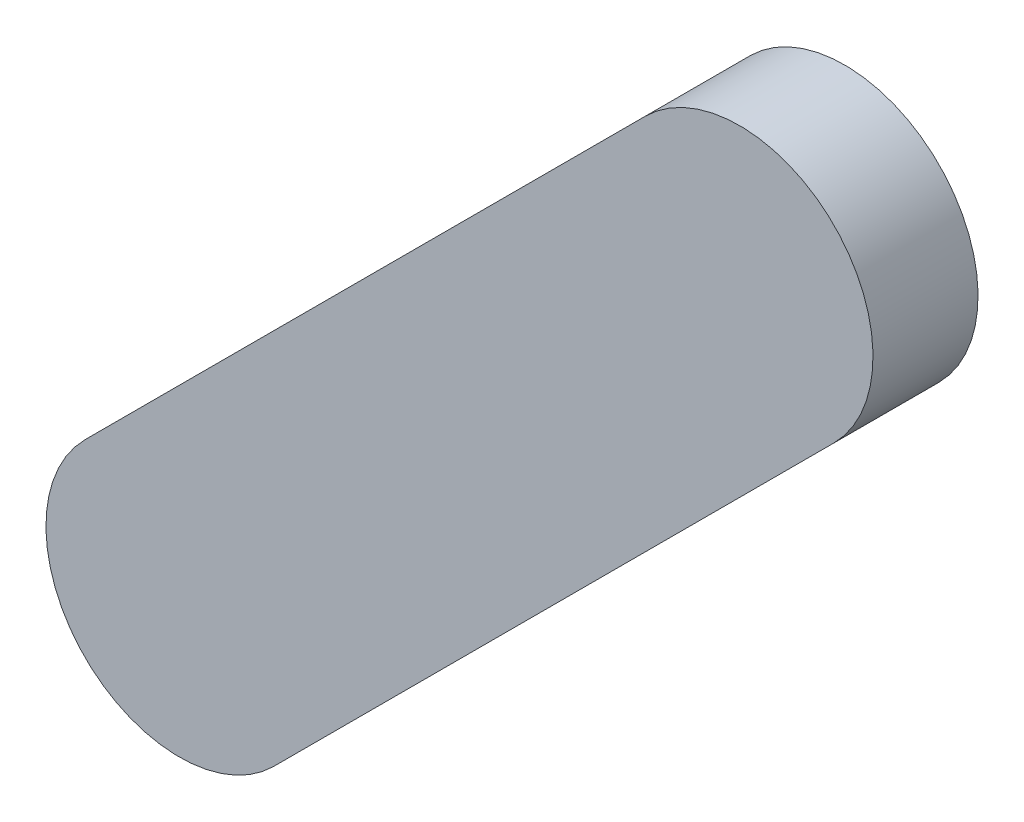
ISO-10303-21;
HEADER;
FILE_DESCRIPTION(('STEP AP214'),'2;1');
FILE_NAME('part.step','',(''),(''),'','','');
FILE_SCHEMA(('AUTOMOTIVE_DESIGN { 1 0 10303 214 1 1 1 1 }'));
ENDSEC;
DATA;
#1=APPLICATION_CONTEXT('core data for automotive mechanical design processes');
#2=APPLICATION_PROTOCOL_DEFINITION('international standard','automotive_design',2000,#1);
#3=PRODUCT_CONTEXT('',#1,'mechanical');
#4=PRODUCT('Part','Part','',(#3));
#5=PRODUCT_RELATED_PRODUCT_CATEGORY('part','',(#4));
#6=PRODUCT_DEFINITION_FORMATION('','',#4);
#7=PRODUCT_DEFINITION_CONTEXT('part definition',#1,'design');
#8=PRODUCT_DEFINITION('design','',#6,#7);
#9=PRODUCT_DEFINITION_SHAPE('','',#8);
#10=(LENGTH_UNIT() NAMED_UNIT(*) SI_UNIT(.MILLI.,.METRE.));
#11=(NAMED_UNIT(*) PLANE_ANGLE_UNIT() SI_UNIT($,.RADIAN.));
#12=(NAMED_UNIT(*) SI_UNIT($,.STERADIAN.) SOLID_ANGLE_UNIT());
#13=UNCERTAINTY_MEASURE_WITH_UNIT(LENGTH_MEASURE(1.E-05),#10,'distance_accuracy_value','');
#14=(GEOMETRIC_REPRESENTATION_CONTEXT(3) GLOBAL_UNCERTAINTY_ASSIGNED_CONTEXT((#13)) GLOBAL_UNIT_ASSIGNED_CONTEXT((#10,
#11,#12)) REPRESENTATION_CONTEXT('',''));
#15=CARTESIAN_POINT('',(0.,0.,0.));
#16=DIRECTION('',(0.,0.,1.));
#17=DIRECTION('',(1.,0.,0.));
#18=AXIS2_PLACEMENT_3D('',#15,#16,#17);
#19=CARTESIAN_POINT('',(111.88880594,116.96519406,0.));
#20=DIRECTION('',(-0.707106781186548,0.707106781186548,0.));
#21=DIRECTION('',(0.707106781186548,0.707106781186548,0.));
#22=AXIS2_PLACEMENT_3D('',#19,#20,#21);
#23=PLANE('',#22);
#24=DIRECTION('',(0.707106781186548,0.707106781186548,0.));
#25=VECTOR('',#24,1.);
#26=CARTESIAN_POINT('',(111.88880594,116.96519406,0.1999996));
#27=LINE('',#26,#25);
#28=CARTESIAN_POINT('',(111.88880594,116.96519406,0.1999996));
#29=VERTEX_POINT('',#28);
#30=CARTESIAN_POINT('',(112.95560594,118.03199406,0.1999996));
#31=VERTEX_POINT('',#30);
#32=EDGE_CURVE('E11',#29,#31,#27,.T.);
#33=ORIENTED_EDGE('',*,*,#32,.F.);
#34=DIRECTION('',(0.,0.,1.));
#35=VECTOR('',#34,1.);
#36=CARTESIAN_POINT('',(111.88880594,116.96519406,0.));
#37=LINE('',#36,#35);
#38=CARTESIAN_POINT('',(111.88880594,116.96519406,0.));
#39=VERTEX_POINT('',#38);
#40=EDGE_CURVE('E24',#39,#29,#37,.T.);
#41=ORIENTED_EDGE('',*,*,#40,.F.);
#42=DIRECTION('',(0.707106781186548,0.707106781186548,0.));
#43=VECTOR('',#42,1.);
#44=CARTESIAN_POINT('',(111.88880594,116.96519406,0.));
#45=LINE('',#44,#43);
#46=CARTESIAN_POINT('',(112.95560594,118.03199406,0.));
#47=VERTEX_POINT('',#46);
#48=EDGE_CURVE('E75',#39,#47,#45,.T.);
#49=ORIENTED_EDGE('',*,*,#48,.T.);
#50=DIRECTION('',(0.,0.,1.));
#51=VECTOR('',#50,1.);
#52=CARTESIAN_POINT('',(112.95560594,118.03199406,0.));
#53=LINE('',#52,#51);
#54=EDGE_CURVE('E37',#47,#31,#53,.T.);
#55=ORIENTED_EDGE('',*,*,#54,.T.);
#56=EDGE_LOOP('',(#33,#41,#49,#55));
#57=FACE_BOUND('',#56,.T.);
#58=ADVANCED_FACE('F17',(#57),#23,.F.);
#59=CARTESIAN_POINT('',(112.776,118.2116,0.));
#60=DIRECTION('',(0.,0.,-1.));
#61=DIRECTION('',(0.707106781186576,-0.70710678118652,0.));
#62=AXIS2_PLACEMENT_3D('',#59,#60,#61);
#63=CYLINDRICAL_SURFACE('',#62,0.254001156230778);
#64=CARTESIAN_POINT('',(112.776,118.2116,0.1999996));
#65=DIRECTION('',(0.,0.,1.));
#66=DIRECTION('',(0.707106781186576,-0.70710678118652,0.));
#67=AXIS2_PLACEMENT_3D('',#64,#65,#66);
#68=CIRCLE('',#67,0.254001156230778);
#69=CARTESIAN_POINT('',(112.59639406,118.39120594,0.1999996));
#70=VERTEX_POINT('',#69);
#71=EDGE_CURVE('E83',#31,#70,#68,.T.);
#72=ORIENTED_EDGE('',*,*,#71,.F.);
#73=ORIENTED_EDGE('',*,*,#54,.F.);
#74=CARTESIAN_POINT('',(112.776,118.2116,0.));
#75=DIRECTION('',(0.,0.,1.));
#76=DIRECTION('',(0.707106781186576,-0.70710678118652,0.));
#77=AXIS2_PLACEMENT_3D('',#74,#75,#76);
#78=CIRCLE('',#77,0.254001156230778);
#79=CARTESIAN_POINT('',(112.59639406,118.39120594,0.));
#80=VERTEX_POINT('',#79);
#81=EDGE_CURVE('E81',#47,#80,#78,.T.);
#82=ORIENTED_EDGE('',*,*,#81,.T.);
#83=DIRECTION('',(0.,0.,1.));
#84=VECTOR('',#83,1.);
#85=CARTESIAN_POINT('',(112.59639406,118.39120594,0.));
#86=LINE('',#85,#84);
#87=EDGE_CURVE('E67',#80,#70,#86,.T.);
#88=ORIENTED_EDGE('',*,*,#87,.T.);
#89=EDGE_LOOP('',(#72,#73,#82,#88));
#90=FACE_BOUND('',#89,.T.);
#91=ADVANCED_FACE('F89',(#90),#63,.T.);
#92=CARTESIAN_POINT('',(112.59639406,118.39120594,0.));
#93=DIRECTION('',(0.707106781186548,-0.707106781186548,0.));
#94=DIRECTION('',(-0.707106781186548,-0.707106781186548,0.));
#95=AXIS2_PLACEMENT_3D('',#92,#93,#94);
#96=PLANE('',#95);
#97=DIRECTION('',(-0.707106781186548,-0.707106781186548,0.));
#98=VECTOR('',#97,1.);
#99=CARTESIAN_POINT('',(112.59639406,118.39120594,0.1999996));
#100=LINE('',#99,#98);
#101=CARTESIAN_POINT('',(111.52959406,117.32440594,0.1999996));
#102=VERTEX_POINT('',#101);
#103=EDGE_CURVE('E71',#70,#102,#100,.T.);
#104=ORIENTED_EDGE('',*,*,#103,.F.);
#105=ORIENTED_EDGE('',*,*,#87,.F.);
#106=DIRECTION('',(-0.707106781186548,-0.707106781186548,0.));
#107=VECTOR('',#106,1.);
#108=CARTESIAN_POINT('',(112.59639406,118.39120594,0.));
#109=LINE('',#108,#107);
#110=CARTESIAN_POINT('',(111.52959406,117.32440594,0.));
#111=VERTEX_POINT('',#110);
#112=EDGE_CURVE('E63',#80,#111,#109,.T.);
#113=ORIENTED_EDGE('',*,*,#112,.T.);
#114=DIRECTION('',(0.,0.,1.));
#115=VECTOR('',#114,1.);
#116=CARTESIAN_POINT('',(111.52959406,117.32440594,0.));
#117=LINE('',#116,#115);
#118=EDGE_CURVE('E53',#111,#102,#117,.T.);
#119=ORIENTED_EDGE('',*,*,#118,.T.);
#120=EDGE_LOOP('',(#104,#105,#113,#119));
#121=FACE_BOUND('',#120,.T.);
#122=ADVANCED_FACE('F66',(#121),#96,.F.);
#123=CARTESIAN_POINT('',(111.7092,117.1448,0.));
#124=DIRECTION('',(0.,0.,-1.));
#125=DIRECTION('',(-0.707106781186548,0.707106781186548,0.));
#126=AXIS2_PLACEMENT_3D('',#123,#124,#125);
#127=CYLINDRICAL_SURFACE('',#126,0.254001156230774);
#128=CARTESIAN_POINT('',(111.7092,117.1448,0.1999996));
#129=DIRECTION('',(0.,0.,1.));
#130=DIRECTION('',(-0.707106781186548,0.707106781186548,0.));
#131=AXIS2_PLACEMENT_3D('',#128,#129,#130);
#132=CIRCLE('',#131,0.254001156230774);
#133=EDGE_CURVE('E59',#102,#29,#132,.T.);
#134=ORIENTED_EDGE('',*,*,#133,.F.);
#135=ORIENTED_EDGE('',*,*,#118,.F.);
#136=CARTESIAN_POINT('',(111.7092,117.1448,0.));
#137=DIRECTION('',(0.,0.,1.));
#138=DIRECTION('',(-0.707106781186548,0.707106781186548,0.));
#139=AXIS2_PLACEMENT_3D('',#136,#137,#138);
#140=CIRCLE('',#139,0.254001156230774);
#141=EDGE_CURVE('E57',#111,#39,#140,.T.);
#142=ORIENTED_EDGE('',*,*,#141,.T.);
#143=ORIENTED_EDGE('',*,*,#40,.T.);
#144=EDGE_LOOP('',(#134,#135,#142,#143));
#145=FACE_BOUND('',#144,.T.);
#146=ADVANCED_FACE('F55',(#145),#127,.T.);
#147=CARTESIAN_POINT('',(111.88880594,116.96519406,0.));
#148=DIRECTION('',(0.,0.,-1.));
#149=DIRECTION('',(-1.,0.,0.));
#150=AXIS2_PLACEMENT_3D('',#147,#148,#149);
#151=PLANE('',#150);
#152=ORIENTED_EDGE('',*,*,#141,.F.);
#153=ORIENTED_EDGE('',*,*,#112,.F.);
#154=ORIENTED_EDGE('',*,*,#81,.F.);
#155=ORIENTED_EDGE('',*,*,#48,.F.);
#156=EDGE_LOOP('',(#152,#153,#154,#155));
#157=FACE_BOUND('',#156,.T.);
#158=ADVANCED_FACE('F74',(#157),#151,.T.);
#159=CARTESIAN_POINT('',(111.88880594,116.96519406,0.1999996));
#160=DIRECTION('',(0.,0.,-1.));
#161=DIRECTION('',(-1.,0.,0.));
#162=AXIS2_PLACEMENT_3D('',#159,#160,#161);
#163=PLANE('',#162);
#164=ORIENTED_EDGE('',*,*,#32,.T.);
#165=ORIENTED_EDGE('',*,*,#71,.T.);
#166=ORIENTED_EDGE('',*,*,#103,.T.);
#167=ORIENTED_EDGE('',*,*,#133,.T.);
#168=EDGE_LOOP('',(#164,#165,#166,#167));
#169=FACE_BOUND('',#168,.T.);
#170=ADVANCED_FACE('F91',(#169),#163,.F.);
#171=CLOSED_SHELL('',(#58,#91,#122,#146,#158,#170));
#172=MANIFOLD_SOLID_BREP('B1',#171);
#173=ADVANCED_BREP_SHAPE_REPRESENTATION('',(#18,#172),#14);
#174=SHAPE_DEFINITION_REPRESENTATION(#9,#173);
ENDSEC;
END-ISO-10303-21;
